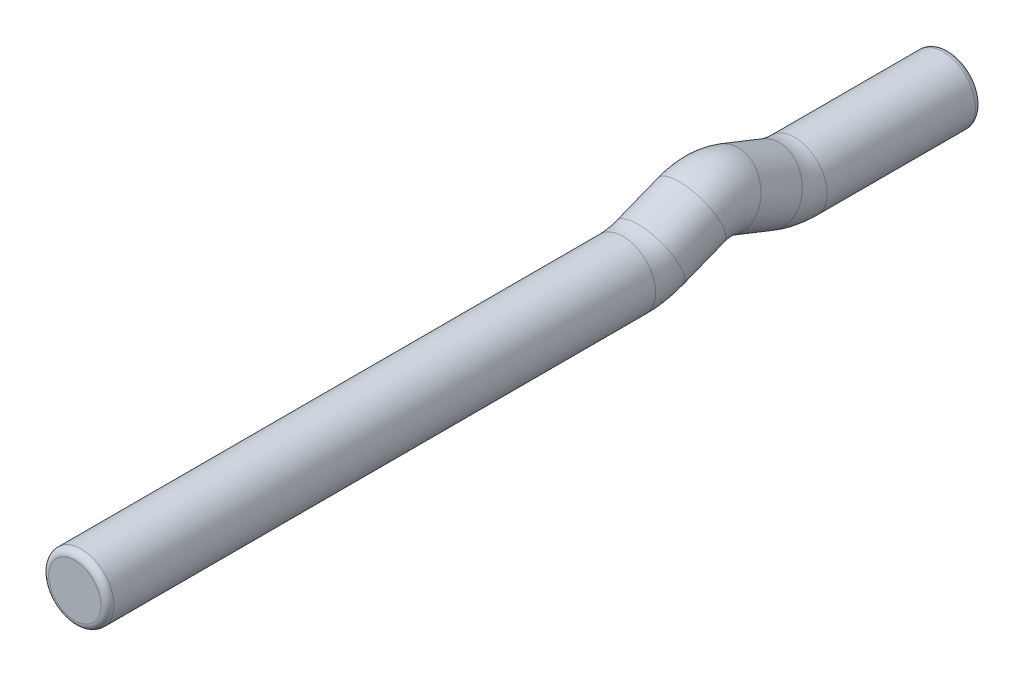
ISO-10303-21;
HEADER;
FILE_DESCRIPTION(('STEP AP214'),'2;1');
FILE_NAME('part.step','',(''),(''),'','','');
FILE_SCHEMA(('AUTOMOTIVE_DESIGN { 1 0 10303 214 1 1 1 1 }'));
ENDSEC;
DATA;
#1=APPLICATION_CONTEXT('core data for automotive mechanical design processes');
#2=APPLICATION_PROTOCOL_DEFINITION('international standard','automotive_design',2000,#1);
#3=PRODUCT_CONTEXT('',#1,'mechanical');
#4=PRODUCT('Part','Part','',(#3));
#5=PRODUCT_RELATED_PRODUCT_CATEGORY('part','',(#4));
#6=PRODUCT_DEFINITION_FORMATION('','',#4);
#7=PRODUCT_DEFINITION_CONTEXT('part definition',#1,'design');
#8=PRODUCT_DEFINITION('design','',#6,#7);
#9=PRODUCT_DEFINITION_SHAPE('','',#8);
#10=(LENGTH_UNIT() NAMED_UNIT(*) SI_UNIT(.MILLI.,.METRE.));
#11=(NAMED_UNIT(*) PLANE_ANGLE_UNIT() SI_UNIT($,.RADIAN.));
#12=(NAMED_UNIT(*) SI_UNIT($,.STERADIAN.) SOLID_ANGLE_UNIT());
#13=UNCERTAINTY_MEASURE_WITH_UNIT(LENGTH_MEASURE(1.E-05),#10,'distance_accuracy_value','');
#14=(GEOMETRIC_REPRESENTATION_CONTEXT(3) GLOBAL_UNCERTAINTY_ASSIGNED_CONTEXT((#13)) GLOBAL_UNIT_ASSIGNED_CONTEXT((#10,
#11,#12)) REPRESENTATION_CONTEXT('',''));
#15=CARTESIAN_POINT('',(0.,0.,0.));
#16=DIRECTION('',(0.,0.,1.));
#17=DIRECTION('',(1.,0.,0.));
#18=AXIS2_PLACEMENT_3D('',#15,#16,#17);
#19=CARTESIAN_POINT('',(0.,0.,0.));
#20=DIRECTION('',(0.,0.,-1.));
#21=DIRECTION('',(0.,-1.,0.));
#22=AXIS2_PLACEMENT_3D('',#19,#20,#21);
#23=CYLINDRICAL_SURFACE('',#22,0.25);
#24=CARTESIAN_POINT('',(0.,0.,0.05));
#25=DIRECTION('',(0.,0.,-1.));
#26=DIRECTION('',(-1.,0.,0.));
#27=AXIS2_PLACEMENT_3D('',#24,#25,#26);
#28=CIRCLE('',#27,0.25);
#29=CARTESIAN_POINT('',(-0.25,0.,0.05));
#30=VERTEX_POINT('',#29);
#31=EDGE_CURVE('E11',#30,#30,#28,.T.);
#32=ORIENTED_EDGE('',*,*,#31,.F.);
#33=CARTESIAN_POINT('',(-0.25,0.,1.18515092162911));
#34=CARTESIAN_POINT('',(-0.25,0.,0.05));
#35=B_SPLINE_CURVE_WITH_KNOTS('',1,(#33,#34),.UNSPECIFIED.,.F.,.F.,(2,2),(-1.18515092162911,
-0.05),.UNSPECIFIED.);
#36=CARTESIAN_POINT('',(-0.25,0.,1.18515092162911));
#37=VERTEX_POINT('',#36);
#38=EDGE_CURVE('E23',#37,#30,#35,.T.);
#39=ORIENTED_EDGE('',*,*,#38,.F.);
#40=CARTESIAN_POINT('',(0.,0.,1.18515092162911));
#41=DIRECTION('',(0.,0.,-1.));
#42=DIRECTION('',(1.,0.,0.));
#43=AXIS2_PLACEMENT_3D('',#40,#41,#42);
#44=CIRCLE('',#43,0.25);
#45=CARTESIAN_POINT('',(0.25,0.,1.18515092162911));
#46=VERTEX_POINT('',#45);
#47=EDGE_CURVE('E142',#37,#46,#44,.T.);
#48=ORIENTED_EDGE('',*,*,#47,.T.);
#49=EDGE_CURVE('E141',#46,#37,#44,.T.);
#50=ORIENTED_EDGE('',*,*,#49,.T.);
#51=ORIENTED_EDGE('',*,*,#38,.T.);
#52=EDGE_LOOP('',(#32,#39,#48,#50,#51));
#53=FACE_BOUND('',#52,.T.);
#54=ADVANCED_FACE('F16',(#53),#23,.T.);
#55=CARTESIAN_POINT('',(0.,0.564074181169507,1.18515092162911));
#56=DIRECTION('',(-1.,0.,0.));
#57=DIRECTION('',(0.,0.,1.));
#58=AXIS2_PLACEMENT_3D('',#55,#56,#57);
#59=TOROIDAL_SURFACE('',#58,0.5640741812,0.25);
#60=CARTESIAN_POINT('',(0.,0.0395196086068588,1.39256881445821));
#61=DIRECTION('',(0.,-0.367713857065861,-0.929938986881262));
#62=DIRECTION('',(1.,0.,0.));
#63=AXIS2_PLACEMENT_3D('',#60,#61,#62);
#64=CIRCLE('',#63,0.25);
#65=CARTESIAN_POINT('',(0.25,0.0395196086068588,1.39256881445821));
#66=VERTEX_POINT('',#65);
#67=EDGE_CURVE('E136',#66,#66,#64,.T.);
#68=ORIENTED_EDGE('',*,*,#67,.T.);
#69=CARTESIAN_POINT('',(0.25,0.,1.18515092162911));
#70=CARTESIAN_POINT('',(0.25,0.,1.23825137626675));
#71=CARTESIAN_POINT('',(0.25,0.00666545287806812,1.29135475233851));
#72=CARTESIAN_POINT('',(0.25,0.0199938356201008,1.34318863146954));
#73=CARTESIAN_POINT('',(0.25,0.039519608606859,1.39256881445821));
#74=B_SPLINE_CURVE_WITH_KNOTS('',4,(#69,#70,#71,#72,#73),.UNSPECIFIED.,.F.,.F.,(5,5),
(4.71238898038469,5.0889384230665),.UNSPECIFIED.);
#75=EDGE_CURVE('E131',#46,#66,#74,.T.);
#76=ORIENTED_EDGE('',*,*,#75,.F.);
#77=ORIENTED_EDGE('',*,*,#47,.F.);
#78=ORIENTED_EDGE('',*,*,#49,.F.);
#79=ORIENTED_EDGE('',*,*,#75,.T.);
#80=EDGE_LOOP('',(#68,#76,#77,#78,#79));
#81=FACE_BOUND('',#80,.T.);
#82=ADVANCED_FACE('F213',(#81),#59,.T.);
#83=CARTESIAN_POINT('',(0.,0.,6.7));
#84=DIRECTION('',(0.,0.,-1.));
#85=DIRECTION('',(-1.,0.,0.));
#86=AXIS2_PLACEMENT_3D('',#83,#84,#85);
#87=PLANE('',#86);
#88=CARTESIAN_POINT('',(0.,0.,6.7));
#89=DIRECTION('',(0.,0.,-1.));
#90=DIRECTION('',(-1.,0.,0.));
#91=AXIS2_PLACEMENT_3D('',#88,#89,#90);
#92=CIRCLE('',#91,0.2);
#93=CARTESIAN_POINT('',(-0.2,0.,6.7));
#94=VERTEX_POINT('',#93);
#95=EDGE_CURVE('E129',#94,#94,#92,.T.);
#96=ORIENTED_EDGE('',*,*,#95,.F.);
#97=EDGE_LOOP('',(#96));
#98=FACE_BOUND('',#97,.T.);
#99=ADVANCED_FACE('F210',(#98),#87,.F.);
#100=CARTESIAN_POINT('',(0.,0.,2.5));
#101=DIRECTION('',(0.,0.,-1.));
#102=DIRECTION('',(0.,-1.,0.));
#103=AXIS2_PLACEMENT_3D('',#100,#101,#102);
#104=CYLINDRICAL_SURFACE('',#103,0.25);
#105=CARTESIAN_POINT('',(0.,0.,6.65));
#106=DIRECTION('',(0.,0.,-1.));
#107=DIRECTION('',(-1.,0.,0.));
#108=AXIS2_PLACEMENT_3D('',#105,#106,#107);
#109=CIRCLE('',#108,0.25);
#110=CARTESIAN_POINT('',(-0.25,0.,6.65));
#111=VERTEX_POINT('',#110);
#112=EDGE_CURVE('E124',#111,#111,#109,.T.);
#113=ORIENTED_EDGE('',*,*,#112,.T.);
#114=CARTESIAN_POINT('',(-0.25,0.,6.65));
#115=CARTESIAN_POINT('',(-0.25,0.,2.5));
#116=B_SPLINE_CURVE_WITH_KNOTS('',1,(#114,#115),.UNSPECIFIED.,.F.,.F.,(2,2),(-4.15,0.),.UNSPECIFIED.);
#117=CARTESIAN_POINT('',(-0.25,0.,2.5));
#118=VERTEX_POINT('',#117);
#119=EDGE_CURVE('E120',#111,#118,#116,.T.);
#120=ORIENTED_EDGE('',*,*,#119,.T.);
#121=CARTESIAN_POINT('',(0.,0.,2.5));
#122=DIRECTION('',(0.,0.,-1.));
#123=DIRECTION('',(1.,0.,0.));
#124=AXIS2_PLACEMENT_3D('',#121,#122,#123);
#125=CIRCLE('',#124,0.25);
#126=CARTESIAN_POINT('',(0.25,0.,2.5));
#127=VERTEX_POINT('',#126);
#128=EDGE_CURVE('E114',#127,#118,#125,.T.);
#129=ORIENTED_EDGE('',*,*,#128,.F.);
#130=EDGE_CURVE('E113',#118,#127,#125,.T.);
#131=ORIENTED_EDGE('',*,*,#130,.F.);
#132=ORIENTED_EDGE('',*,*,#119,.F.);
#133=EDGE_LOOP('',(#113,#120,#129,#131,#132));
#134=FACE_BOUND('',#133,.T.);
#135=ADVANCED_FACE('F206',(#134),#104,.T.);
#136=CARTESIAN_POINT('',(0.,0.,6.65));
#137=DIRECTION('',(0.,0.,-1.));
#138=DIRECTION('',(-1.,0.,0.));
#139=AXIS2_PLACEMENT_3D('',#136,#137,#138);
#140=TOROIDAL_SURFACE('',#139,0.2,0.05);
#141=ORIENTED_EDGE('',*,*,#112,.F.);
#142=CARTESIAN_POINT('',(-0.2,0.,6.7));
#143=CARTESIAN_POINT('',(-0.215707963267948,0.,6.69999999999998));
#144=CARTESIAN_POINT('',(-0.231430582168145,0.,6.69384924979774));
#145=CARTESIAN_POINT('',(-0.243849249797713,0.,6.68143058216813));
#146=CARTESIAN_POINT('',(-0.25,0.,6.66570796326795));
#147=CARTESIAN_POINT('',(-0.25,0.,6.65));
#148=B_SPLINE_CURVE_WITH_KNOTS('',5,(#142,#143,#144,#145,#146,#147),.UNSPECIFIED.,.F.,.F.,(6,6),
(-1.5707963267949,0.),.UNSPECIFIED.);
#149=EDGE_CURVE('E105',#94,#111,#148,.T.);
#150=ORIENTED_EDGE('',*,*,#149,.F.);
#151=ORIENTED_EDGE('',*,*,#95,.T.);
#152=ORIENTED_EDGE('',*,*,#149,.T.);
#153=EDGE_LOOP('',(#141,#150,#151,#152));
#154=FACE_BOUND('',#153,.T.);
#155=ADVANCED_FACE('F202',(#154),#140,.T.);
#156=CARTESIAN_POINT('',(0.,0.564074181169508,2.5));
#157=DIRECTION('',(-1.,0.,0.));
#158=DIRECTION('',(0.,0.,1.));
#159=AXIS2_PLACEMENT_3D('',#156,#157,#158);
#160=TOROIDAL_SURFACE('',#159,0.5640741812,0.25);
#161=ORIENTED_EDGE('',*,*,#128,.T.);
#162=ORIENTED_EDGE('',*,*,#130,.T.);
#163=CARTESIAN_POINT('',(0.25,0.0395196086068617,2.29258210717089));
#164=CARTESIAN_POINT('',(0.25,0.0199938356201016,2.34196229015956));
#165=CARTESIAN_POINT('',(0.25,0.00666545287806786,2.39379616929059));
#166=CARTESIAN_POINT('',(0.25,0.,2.44689954536235));
#167=CARTESIAN_POINT('',(0.25,0.,2.5));
#168=B_SPLINE_CURVE_WITH_KNOTS('',4,(#163,#164,#165,#166,#167),.UNSPECIFIED.,.F.,.F.,(5,5),
(4.33583953770286,4.71238898038469),.UNSPECIFIED.);
#169=CARTESIAN_POINT('',(0.25,0.0395196086068613,2.29258210717089));
#170=VERTEX_POINT('',#169);
#171=EDGE_CURVE('E100',#170,#127,#168,.T.);
#172=ORIENTED_EDGE('',*,*,#171,.F.);
#173=CARTESIAN_POINT('',(0.,0.0395196086068613,2.29258210717089));
#174=DIRECTION('',(0.,0.367713857065871,-0.929938986881258));
#175=DIRECTION('',(1.,0.,0.));
#176=AXIS2_PLACEMENT_3D('',#173,#174,#175);
#177=CIRCLE('',#176,0.25);
#178=EDGE_CURVE('E97',#170,#170,#177,.T.);
#179=ORIENTED_EDGE('',*,*,#178,.F.);
#180=ORIENTED_EDGE('',*,*,#171,.T.);
#181=EDGE_LOOP('',(#161,#162,#172,#179,#180));
#182=FACE_BOUND('',#181,.T.);
#183=ADVANCED_FACE('F198',(#182),#160,.T.);
#184=CARTESIAN_POINT('',(0.,0.,0.));
#185=DIRECTION('',(0.,0.,-1.));
#186=DIRECTION('',(-1.,0.,0.));
#187=AXIS2_PLACEMENT_3D('',#184,#185,#186);
#188=PLANE('',#187);
#189=CARTESIAN_POINT('',(0.,0.,0.));
#190=DIRECTION('',(0.,0.,-1.));
#191=DIRECTION('',(-1.,0.,0.));
#192=AXIS2_PLACEMENT_3D('',#189,#190,#191);
#193=CIRCLE('',#192,0.2);
#194=CARTESIAN_POINT('',(-0.2,0.,0.));
#195=VERTEX_POINT('',#194);
#196=EDGE_CURVE('E95',#195,#195,#193,.T.);
#197=ORIENTED_EDGE('',*,*,#196,.T.);
#198=EDGE_LOOP('',(#197));
#199=FACE_BOUND('',#198,.T.);
#200=ADVANCED_FACE('F194',(#199),#188,.T.);
#201=CARTESIAN_POINT('',(0.,0.0395196086068586,1.39256881445821));
#202=DIRECTION('',(0.,-0.367713857065818,-0.929938986881279));
#203=DIRECTION('',(0.,-0.929938986881279,0.367713857065818));
#204=AXIS2_PLACEMENT_3D('',#201,#202,#203);
#205=CYLINDRICAL_SURFACE('',#204,0.25);
#206=CARTESIAN_POINT('',(0.,0.164463903080654,1.70854975558103));
#207=DIRECTION('',(0.,-0.367713857065818,-0.929938986881279));
#208=DIRECTION('',(1.,0.,0.));
#209=AXIS2_PLACEMENT_3D('',#206,#207,#208);
#210=CIRCLE('',#209,0.25);
#211=CARTESIAN_POINT('',(0.25,0.164463903080654,1.70854975558103));
#212=VERTEX_POINT('',#211);
#213=EDGE_CURVE('E79',#212,#212,#210,.T.);
#214=ORIENTED_EDGE('',*,*,#213,.T.);
#215=CARTESIAN_POINT('',(0.25,0.164463903080655,1.70854975558103));
#216=CARTESIAN_POINT('',(0.25,0.0395196086068573,1.39256881445821));
#217=B_SPLINE_CURVE_WITH_KNOTS('',1,(#215,#216),.UNSPECIFIED.,.F.,.F.,(2,2),(-0.339786744700875,
0.),.UNSPECIFIED.);
#218=EDGE_CURVE('E76',#212,#66,#217,.T.);
#219=ORIENTED_EDGE('',*,*,#218,.T.);
#220=ORIENTED_EDGE('',*,*,#67,.F.);
#221=ORIENTED_EDGE('',*,*,#218,.F.);
#222=EDGE_LOOP('',(#214,#219,#220,#221));
#223=FACE_BOUND('',#222,.T.);
#224=ADVANCED_FACE('F182',(#223),#205,.T.);
#225=CARTESIAN_POINT('',(0.,-0.174483694748372,1.84257546081455));
#226=DIRECTION('',(1.,0.,0.));
#227=DIRECTION('',(0.,0.,-1.));
#228=AXIS2_PLACEMENT_3D('',#225,#226,#227);
#229=TOROIDAL_SURFACE('',#228,0.3644836947,0.25);
#230=CARTESIAN_POINT('',(0.,0.164463903080649,1.97660116604807));
#231=DIRECTION('',(0.,0.367713857065854,-0.929938986881265));
#232=DIRECTION('',(1.,0.,0.));
#233=AXIS2_PLACEMENT_3D('',#230,#231,#232);
#234=CIRCLE('',#233,0.25);
#235=CARTESIAN_POINT('',(0.25,0.164463903080649,1.97660116604807));
#236=VERTEX_POINT('',#235);
#237=EDGE_CURVE('E67',#236,#236,#234,.T.);
#238=ORIENTED_EDGE('',*,*,#237,.T.);
#239=CARTESIAN_POINT('',(0.25,0.16446390308065,1.70854975558103));
#240=CARTESIAN_POINT('',(0.25,0.16656680869815,1.71386765950234));
#241=CARTESIAN_POINT('',(0.25,0.168544361544562,1.71923512068004));
#242=CARTESIAN_POINT('',(0.25,0.172244826160265,1.73005711623128));
#243=CARTESIAN_POINT('',(0.25,0.173967737929555,1.73551165060482));
#244=CARTESIAN_POINT('',(0.25,0.177154984856065,1.74649575123078));
#245=CARTESIAN_POINT('',(0.25,0.178619320013284,1.75202531748321));
#246=CARTESIAN_POINT('',(0.25,0.181286202076188,1.76314722267075));
#247=CARTESIAN_POINT('',(0.25,0.182488748981872,1.76873956160586));
#248=CARTESIAN_POINT('',(0.25,0.184629382280191,1.77997462776534));
#249=CARTESIAN_POINT('',(0.25,0.185567468672826,1.7856173549897));
#250=CARTESIAN_POINT('',(0.25,0.187177105328524,1.79694069801126));
#251=CARTESIAN_POINT('',(0.25,0.187848655591587,1.80262131380845));
#252=CARTESIAN_POINT('',(0.25,0.188923731854325,1.81400785132792));
#253=CARTESIAN_POINT('',(0.25,0.189327257854001,1.81971377305021));
#254=CARTESIAN_POINT('',(0.25,0.189865391926826,1.83113828345318));
#255=CARTESIAN_POINT('',(0.25,0.189999999999975,1.83685687213387));
#256=CARTESIAN_POINT('',(0.25,0.189999999999975,1.84829404949524));
#257=CARTESIAN_POINT('',(0.25,0.189865391926826,1.85401263817592));
#258=CARTESIAN_POINT('',(0.25,0.189327257854001,1.86543714857889));
#259=CARTESIAN_POINT('',(0.25,0.188923731854325,1.87114307030118));
#260=CARTESIAN_POINT('',(0.25,0.187848655591587,1.88252960782065));
#261=CARTESIAN_POINT('',(0.25,0.187177105328524,1.88821022361785));
#262=CARTESIAN_POINT('',(0.25,0.185567468672826,1.8995335666394));
#263=CARTESIAN_POINT('',(0.25,0.18462938228019,1.90517629386377));
#264=CARTESIAN_POINT('',(0.25,0.182488748981871,1.91641136002324));
#265=CARTESIAN_POINT('',(0.25,0.181286202076187,1.92200369895835));
#266=CARTESIAN_POINT('',(0.25,0.178619320013284,1.93312560414589));
#267=CARTESIAN_POINT('',(0.25,0.177154984856064,1.93865517039832));
#268=CARTESIAN_POINT('',(0.25,0.173967737929554,1.94963927102429));
#269=CARTESIAN_POINT('',(0.25,0.172244826160264,1.95509380539782));
#270=CARTESIAN_POINT('',(0.25,0.168544361544562,1.96591580094906));
#271=CARTESIAN_POINT('',(0.25,0.166566808698149,1.97128326212676));
#272=CARTESIAN_POINT('',(0.25,0.164463903080649,1.97660116604807));
#273=B_SPLINE_CURVE_WITH_KNOTS('',3,(#239,#240,#241,#242,#243,#244,#245,#246,#247,#248,#249,
#250,#251,#252,#253,#254,#255,#256,#257,#258,#259,#260,#261,#262,#263,#264,#265,#266,#267,#268,
#269,#270,#271,#272),.UNSPECIFIED.,.F.,.F.,(4,2,2,2,2,2,2,2,2,2,2,2,2,2,2,2,4),(0.,
0.0171541828957855,0.0343083657915717,0.0514625486873576,0.0686167315831431,0.0857709144789296,
0.102925097374715,0.120079280270501,0.137233463166287,0.154387646062073,0.171541828957859,
0.188696011853645,0.20585019474943,0.223004377645216,0.240158560541002,0.257312743436788,
0.274466926332574),.UNSPECIFIED.);
#274=EDGE_CURVE('E70',#212,#236,#273,.T.);
#275=ORIENTED_EDGE('',*,*,#274,.F.);
#276=ORIENTED_EDGE('',*,*,#213,.F.);
#277=ORIENTED_EDGE('',*,*,#274,.T.);
#278=EDGE_LOOP('',(#238,#275,#276,#277));
#279=FACE_BOUND('',#278,.T.);
#280=ADVANCED_FACE('F68',(#279),#229,.T.);
#281=CARTESIAN_POINT('',(0.,0.164463903080674,1.97660116604808));
#282=DIRECTION('',(0.,0.367713857065871,-0.929938986881258));
#283=DIRECTION('',(0.,-0.929938986881258,-0.367713857065871));
#284=AXIS2_PLACEMENT_3D('',#281,#282,#283);
#285=CYLINDRICAL_SURFACE('',#284,0.25);
#286=ORIENTED_EDGE('',*,*,#178,.T.);
#287=CARTESIAN_POINT('',(0.25,0.0395196086068612,2.29258210717089));
#288=CARTESIAN_POINT('',(0.25,0.164463903080675,1.97660116604808));
#289=B_SPLINE_CURVE_WITH_KNOTS('',1,(#287,#288),.UNSPECIFIED.,.F.,.F.,(2,2),(-0.339786744700872,
0.),.UNSPECIFIED.);
#290=EDGE_CURVE('E81',#170,#236,#289,.T.);
#291=ORIENTED_EDGE('',*,*,#290,.T.);
#292=ORIENTED_EDGE('',*,*,#237,.F.);
#293=ORIENTED_EDGE('',*,*,#290,.F.);
#294=EDGE_LOOP('',(#286,#291,#292,#293));
#295=FACE_BOUND('',#294,.T.);
#296=ADVANCED_FACE('F181',(#295),#285,.T.);
#297=CARTESIAN_POINT('',(0.,0.,0.05));
#298=DIRECTION('',(0.,0.,-1.));
#299=DIRECTION('',(-1.,0.,0.));
#300=AXIS2_PLACEMENT_3D('',#297,#298,#299);
#301=TOROIDAL_SURFACE('',#300,0.2,0.05);
#302=ORIENTED_EDGE('',*,*,#196,.F.);
#303=CARTESIAN_POINT('',(-0.25,0.,0.05));
#304=CARTESIAN_POINT('',(-0.249999999999999,0.,0.034292036732051));
#305=CARTESIAN_POINT('',(-0.243849249797714,0.,0.0185694178318551));
#306=CARTESIAN_POINT('',(-0.231430582168144,0.,0.00615075020228677));
#307=CARTESIAN_POINT('',(-0.215707963267949,0.,0.));
#308=CARTESIAN_POINT('',(-0.2,0.,0.));
#309=B_SPLINE_CURVE_WITH_KNOTS('',5,(#303,#304,#305,#306,#307,#308),.UNSPECIFIED.,.F.,.F.,(6,6),
(0.,1.5707963267949),.UNSPECIFIED.);
#310=EDGE_CURVE('E151',#30,#195,#309,.T.);
#311=ORIENTED_EDGE('',*,*,#310,.F.);
#312=ORIENTED_EDGE('',*,*,#31,.T.);
#313=ORIENTED_EDGE('',*,*,#310,.T.);
#314=EDGE_LOOP('',(#302,#311,#312,#313));
#315=FACE_BOUND('',#314,.T.);
#316=ADVANCED_FACE('F152',(#315),#301,.T.);
#317=CLOSED_SHELL('',(#54,#82,#99,#135,#155,#183,#200,#224,#280,#296,#316));
#318=MANIFOLD_SOLID_BREP('B1',#317);
#319=ADVANCED_BREP_SHAPE_REPRESENTATION('',(#18,#318),#14);
#320=SHAPE_DEFINITION_REPRESENTATION(#9,#319);
ENDSEC;
END-ISO-10303-21;
